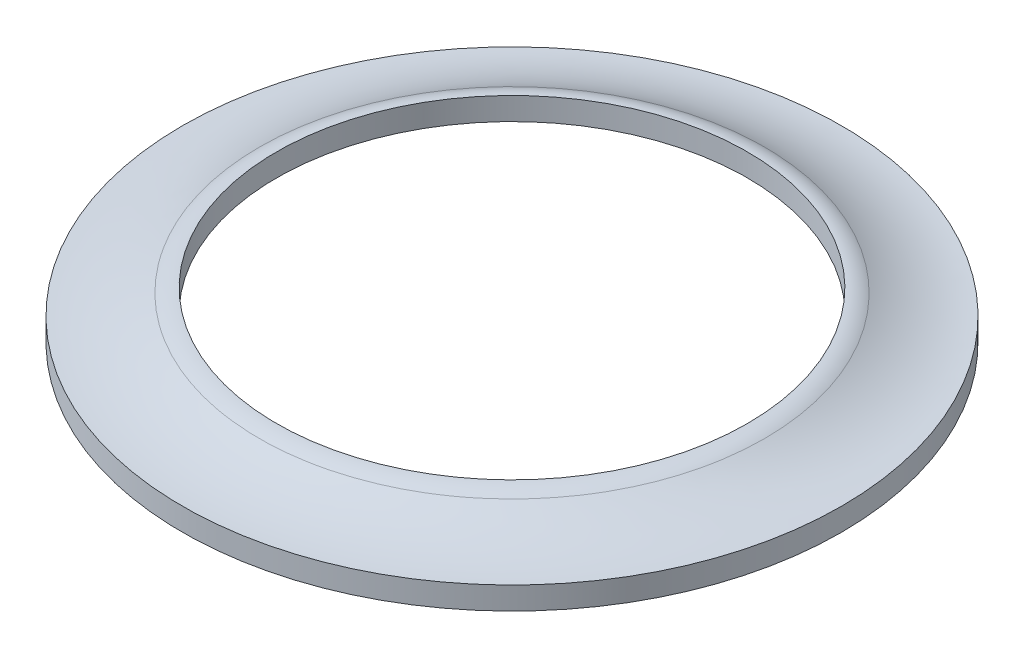
ISO-10303-21;
HEADER;
FILE_DESCRIPTION(('STEP AP214'),'2;1');
FILE_NAME('part.step','',(''),(''),'','','');
FILE_SCHEMA(('AUTOMOTIVE_DESIGN { 1 0 10303 214 1 1 1 1 }'));
ENDSEC;
DATA;
#1=APPLICATION_CONTEXT('core data for automotive mechanical design processes');
#2=APPLICATION_PROTOCOL_DEFINITION('international standard','automotive_design',2000,#1);
#3=PRODUCT_CONTEXT('',#1,'mechanical');
#4=PRODUCT('Part','Part','',(#3));
#5=PRODUCT_RELATED_PRODUCT_CATEGORY('part','',(#4));
#6=PRODUCT_DEFINITION_FORMATION('','',#4);
#7=PRODUCT_DEFINITION_CONTEXT('part definition',#1,'design');
#8=PRODUCT_DEFINITION('design','',#6,#7);
#9=PRODUCT_DEFINITION_SHAPE('','',#8);
#10=(LENGTH_UNIT() NAMED_UNIT(*) SI_UNIT(.MILLI.,.METRE.));
#11=(NAMED_UNIT(*) PLANE_ANGLE_UNIT() SI_UNIT($,.RADIAN.));
#12=(NAMED_UNIT(*) SI_UNIT($,.STERADIAN.) SOLID_ANGLE_UNIT());
#13=UNCERTAINTY_MEASURE_WITH_UNIT(LENGTH_MEASURE(1.E-05),#10,'distance_accuracy_value','');
#14=(GEOMETRIC_REPRESENTATION_CONTEXT(3) GLOBAL_UNCERTAINTY_ASSIGNED_CONTEXT((#13)) GLOBAL_UNIT_ASSIGNED_CONTEXT((#10,
#11,#12)) REPRESENTATION_CONTEXT('',''));
#15=CARTESIAN_POINT('',(0.,0.,0.));
#16=DIRECTION('',(0.,0.,1.));
#17=DIRECTION('',(1.,0.,0.));
#18=AXIS2_PLACEMENT_3D('',#15,#16,#17);
#19=CARTESIAN_POINT('',(0.,0.200464615384616,0.));
#20=DIRECTION('',(0.,-1.,0.));
#21=DIRECTION('',(1.,0.,0.));
#22=AXIS2_PLACEMENT_3D('',#19,#20,#21);
#23=TOROIDAL_SURFACE('',#22,3.96875,0.593285384615384);
#24=CARTESIAN_POINT('',(4.25772377294884,0.71861681903325,0.));
#25=CARTESIAN_POINT('',(4.25772377294884,0.71861681903325,0.55733473557947));
#26=CARTESIAN_POINT('',(4.1469066185021,0.718616819033126,1.11445019253542));
#27=CARTESIAN_POINT('',(3.72034107932625,0.718616819033375,2.14427050245358));
#28=CARTESIAN_POINT('',(3.40476052319012,0.718616819033165,2.6165701813527));
#29=CARTESIAN_POINT('',(2.6165701813525,0.718616819033336,3.40476052318989));
#30=CARTESIAN_POINT('',(2.14427050245361,0.718616819033335,3.72034107932631));
#31=CARTESIAN_POINT('',(1.1144501925354,0.718616819033163,4.14690661850203));
#32=CARTESIAN_POINT('',(0.557334735579084,0.71861681903325,4.25772377294884));
#33=CARTESIAN_POINT('',(-0.557334735579099,0.718616819033249,4.25772377294884));
#34=CARTESIAN_POINT('',(-1.11445019253532,0.718616819033175,4.14690661850204));
#35=CARTESIAN_POINT('',(-2.14427050245368,0.718616819033323,3.72034107932631));
#36=CARTESIAN_POINT('',(-2.61657018135237,0.718616819033295,3.4047605231901));
#37=CARTESIAN_POINT('',(-3.40476052319021,0.718616819033201,2.61657018135251));
#38=CARTESIAN_POINT('',(-3.72034107932638,0.718616819033309,2.14427050245356));
#39=CARTESIAN_POINT('',(-4.14690661850196,0.718616819033187,1.11445019253545));
#40=CARTESIAN_POINT('',(-4.25772377294884,0.718616819033248,0.557334735579082));
#41=CARTESIAN_POINT('',(-4.25772377294884,0.718616819033247,-0.5573347355791));
#42=CARTESIAN_POINT('',(-4.14690661850217,0.718616819033125,-1.11445019253524));
#43=CARTESIAN_POINT('',(-3.72034107932618,0.718616819033371,-2.14427050245376));
#44=CARTESIAN_POINT('',(-3.4047605231902,0.718616819033154,-2.61657018135264));
#45=CARTESIAN_POINT('',(-2.6165701813524,0.718616819033343,-3.40476052318996));
#46=CARTESIAN_POINT('',(-2.14427050245354,0.718616819033185,-3.72034107932663));
#47=CARTESIAN_POINT('',(-1.11445019253548,0.718616819033311,-4.14690661850171));
#48=CARTESIAN_POINT('',(-0.557334735579088,0.718616819033249,-4.25772377294884));
#49=CARTESIAN_POINT('',(0.557334735579093,0.718616819033249,-4.25772377294884));
#50=CARTESIAN_POINT('',(1.1144501925352,0.718616819033164,-4.14690661850211));
#51=CARTESIAN_POINT('',(2.14427050245381,0.718616819033335,-3.72034107932623));
#52=CARTESIAN_POINT('',(2.61657018135237,0.718616819033429,-3.40476052318977));
#53=CARTESIAN_POINT('',(3.40476052319023,0.71861681903307,-2.61657018135282));
#54=CARTESIAN_POINT('',(3.72034107932599,0.71861681903346,-2.14427050245379));
#55=CARTESIAN_POINT('',(4.14690661850235,0.718616819033039,-1.11445019253521));
#56=CARTESIAN_POINT('',(4.25772377294884,0.71861681903325,-0.55733473557947));
#57=CARTESIAN_POINT('',(4.25772377294884,0.71861681903325,0.));
#58=(BOUNDED_CURVE() B_SPLINE_CURVE(3,(#24,#25,#26,#27,#28,#29,#30,#31,#32,#33,#34,#35,#36,#37,
#38,#39,#40,#41,#42,#43,#44,#45,#46,#47,#48,#49,#50,#51,#52,#53,#54,#55,#56,#57),.UNSPECIFIED.,
.T.,.F.) B_SPLINE_CURVE_WITH_KNOTS((4,2,2,2,2,2,2,2,2,2,2,2,2,2,2,2,4),(-6.28318530717959,
-5.89048622548086,-5.49778714378214,-5.10508806208341,-4.71238898038469,-4.31968989868597,
-3.92699081698724,-3.53429173528852,-3.14159265358979,-2.74889357189107,-2.35619449019234,
-1.96349540849362,-1.5707963267949,-1.17809724509617,-0.785398163397448,-0.392699081698724,0.),
.UNSPECIFIED.) CURVE() GEOMETRIC_REPRESENTATION_ITEM() RATIONAL_B_SPLINE_CURVE((1.,1.,1.,1.,1.,
1.,1.,1.,1.,1.,1.,1.,1.,1.,1.,1.,1.,1.,1.,1.,1.,1.,1.,1.,1.,1.,1.,1.,1.,1.,1.,1.,1.,1.)) REPRESENTATION_ITEM(''));
#59=CARTESIAN_POINT('',(4.25772377294886,0.718616819033271,0.));
#60=VERTEX_POINT('',#59);
#61=CARTESIAN_POINT('',(-4.25772377294889,0.718616819033248,0.));
#62=VERTEX_POINT('',#61);
#63=EDGE_CURVE('E122',#60,#62,#58,.T.);
#64=ORIENTED_EDGE('',*,*,#63,.F.);
#65=CARTESIAN_POINT('',(0.,0.718616819033249,0.));
#66=DIRECTION('',(0.,1.,0.));
#67=DIRECTION('',(1.,0.,0.));
#68=AXIS2_PLACEMENT_3D('',#65,#66,#67);
#69=CIRCLE('',#68,4.25772377294884);
#70=EDGE_CURVE('E38',#60,#62,#69,.T.);
#71=ORIENTED_EDGE('',*,*,#70,.T.);
#72=EDGE_LOOP('',(#64,#71));
#73=FACE_BOUND('',#72,.T.);
#74=CARTESIAN_POINT('',(0.,0.793750000000001,0.));
#75=DIRECTION('',(0.,-1.,0.));
#76=DIRECTION('',(1.,0.,0.));
#77=AXIS2_PLACEMENT_3D('',#74,#75,#76);
#78=CIRCLE('',#77,3.96875);
#79=CARTESIAN_POINT('',(3.96875,0.793750000000002,0.));
#80=VERTEX_POINT('',#79);
#81=EDGE_CURVE('E123',#80,#80,#78,.T.);
#82=ORIENTED_EDGE('',*,*,#81,.T.);
#83=EDGE_LOOP('',(#82));
#84=FACE_BOUND('',#83,.T.);
#85=ADVANCED_FACE('F16',(#73,#84),#23,.T.);
#86=CARTESIAN_POINT('',(0.,0.,0.));
#87=DIRECTION('',(0.,-1.,0.));
#88=DIRECTION('',(1.,0.,0.));
#89=AXIS2_PLACEMENT_3D('',#86,#87,#88);
#90=CYLINDRICAL_SURFACE('',#89,3.96875);
#91=CARTESIAN_POINT('',(0.,0.412750000000001,0.));
#92=DIRECTION('',(0.,-1.,0.));
#93=DIRECTION('',(1.,0.,0.));
#94=AXIS2_PLACEMENT_3D('',#91,#92,#93);
#95=CIRCLE('',#94,3.96875);
#96=CARTESIAN_POINT('',(3.96875,0.412750000000002,0.));
#97=VERTEX_POINT('',#96);
#98=EDGE_CURVE('E117',#97,#97,#95,.T.);
#99=ORIENTED_EDGE('',*,*,#98,.T.);
#100=EDGE_LOOP('',(#99));
#101=FACE_BOUND('',#100,.T.);
#102=ORIENTED_EDGE('',*,*,#81,.F.);
#103=EDGE_LOOP('',(#102));
#104=FACE_BOUND('',#103,.T.);
#105=ADVANCED_FACE('F150',(#101,#104),#90,.F.);
#106=CARTESIAN_POINT('',(5.5696669872879,0.381000000000002,0.));
#107=CARTESIAN_POINT('',(5.5696669872879,0.381000000000002,0.729067699823068));
#108=CARTESIAN_POINT('',(5.42470346225363,0.380999999999996,1.45784855414463));
#109=CARTESIAN_POINT('',(4.86669920266455,0.381000000000008,2.80499000550708));
#110=CARTESIAN_POINT('',(4.45387801015091,0.380999999999998,3.42282058117365));
#111=CARTESIAN_POINT('',(3.42282058117335,0.381000000000006,4.45387801015057));
#112=CARTESIAN_POINT('',(2.80499000550693,0.380999999999999,4.86669920266422));
#113=CARTESIAN_POINT('',(1.4578485541448,0.381000000000004,5.42470346225396));
#114=CARTESIAN_POINT('',(0.729067699822562,0.381000000000001,5.5696669872879));
#115=CARTESIAN_POINT('',(-0.729067699822582,0.381000000000001,5.5696669872879));
#116=CARTESIAN_POINT('',(-1.45784855414463,0.380999999999999,5.42470346225363));
#117=CARTESIAN_POINT('',(-2.80499000550708,0.381000000000002,4.86669920266456));
#118=CARTESIAN_POINT('',(-3.42282058117333,0.381000000000002,4.45387801015059));
#119=CARTESIAN_POINT('',(-4.45387801015089,0.380999999999998,3.42282058117367));
#120=CARTESIAN_POINT('',(-4.86669920266455,0.380999999999994,2.80499000550694));
#121=CARTESIAN_POINT('',(-5.42470346225362,0.381000000000006,1.4578485541448));
#122=CARTESIAN_POINT('',(-5.5696669872879,0.381,0.729067699822559));
#123=CARTESIAN_POINT('',(-5.5696669872879,0.381,-0.729067699822583));
#124=CARTESIAN_POINT('',(-5.42470346225394,0.38100000000001,-1.45784855414478));
#125=CARTESIAN_POINT('',(-4.86669920266425,0.380999999999989,-2.80499000550693));
#126=CARTESIAN_POINT('',(-4.4538780101509,0.380999999999998,-3.42282058117366));
#127=CARTESIAN_POINT('',(-3.42282058117334,0.381000000000002,-4.45387801015059));
#128=CARTESIAN_POINT('',(-2.8049900055071,0.380999999999988,-4.86669920266454));
#129=CARTESIAN_POINT('',(-1.45784855414464,0.381000000000013,-5.42470346225364));
#130=CARTESIAN_POINT('',(-0.729067699822567,0.381000000000001,-5.5696669872879));
#131=CARTESIAN_POINT('',(0.729067699822575,0.381000000000001,-5.5696669872879));
#132=CARTESIAN_POINT('',(1.45784855414464,0.381000000000004,-5.42470346225395));
#133=CARTESIAN_POINT('',(2.80499000550709,0.380999999999999,-4.86669920266423));
#134=CARTESIAN_POINT('',(3.42282058117398,0.380999999999993,-4.45387801015089));
#135=CARTESIAN_POINT('',(4.45387801015027,0.381000000000011,-3.42282058117335));
#136=CARTESIAN_POINT('',(4.86669920266448,0.381000000000004,-2.80499000550714));
#137=CARTESIAN_POINT('',(5.42470346225371,0.381000000000001,-1.45784855414458));
#138=CARTESIAN_POINT('',(5.5696669872879,0.381000000000002,-0.729067699823067));
#139=CARTESIAN_POINT('',(5.5696669872879,0.381000000000002,0.));
#140=CARTESIAN_POINT('',(5.56295849364395,0.381000000000002,0.));
#141=CARTESIAN_POINT('',(5.56295849364395,0.381000000000002,0.728189560063288));
#142=CARTESIAN_POINT('',(5.41816957274464,0.380999999999999,1.45609262012171));
#143=CARTESIAN_POINT('',(4.8608374122303,0.381000000000005,2.80161148078267));
#144=CARTESIAN_POINT('',(4.44851345022476,0.381,3.41869789840544));
#145=CARTESIAN_POINT('',(3.41869789840514,0.381000000000004,4.44851345022442));
#146=CARTESIAN_POINT('',(2.80161148078253,0.381,4.86083741222997));
#147=CARTESIAN_POINT('',(1.45609262012188,0.381000000000003,5.41816957274495));
#148=CARTESIAN_POINT('',(0.728189560062783,0.381000000000001,5.56295849364395));
#149=CARTESIAN_POINT('',(-0.728189560062802,0.381000000000001,5.56295849364395));
#150=CARTESIAN_POINT('',(-1.4560926201217,0.381,5.41816957274463));
#151=CARTESIAN_POINT('',(-2.80161148078267,0.381000000000001,4.8608374122303));
#152=CARTESIAN_POINT('',(-3.41869789840512,0.381000000000001,4.44851345022444));
#153=CARTESIAN_POINT('',(-4.44851345022474,0.380999999999999,3.41869789840545));
#154=CARTESIAN_POINT('',(-4.86083741223029,0.380999999999997,2.80161148078253));
#155=CARTESIAN_POINT('',(-5.41816957274463,0.381000000000003,1.45609262012188));
#156=CARTESIAN_POINT('',(-5.56295849364395,0.381,0.72818956006278));
#157=CARTESIAN_POINT('',(-5.56295849364395,0.381,-0.728189560062803));
#158=CARTESIAN_POINT('',(-5.41816957274494,0.381000000000005,-1.45609262012186));
#159=CARTESIAN_POINT('',(-4.86083741222999,0.380999999999995,-2.80161148078252));
#160=CARTESIAN_POINT('',(-4.44851345022474,0.380999999999999,-3.41869789840545));
#161=CARTESIAN_POINT('',(-3.41869789840513,0.381000000000001,-4.44851345022443));
#162=CARTESIAN_POINT('',(-2.80161148078269,0.380999999999994,-4.86083741223029));
#163=CARTESIAN_POINT('',(-1.45609262012172,0.381000000000007,-5.41816957274463));
#164=CARTESIAN_POINT('',(-0.728189560062788,0.381000000000001,-5.56295849364395));
#165=CARTESIAN_POINT('',(0.728189560062795,0.381000000000001,-5.56295849364395));
#166=CARTESIAN_POINT('',(1.45609262012171,0.381000000000003,-5.41816957274495));
#167=CARTESIAN_POINT('',(2.80161148078268,0.381,-4.86083741222998));
#168=CARTESIAN_POINT('',(3.41869789840576,0.380999999999997,-4.44851345022474));
#169=CARTESIAN_POINT('',(4.44851345022412,0.381000000000007,-3.41869789840513));
#170=CARTESIAN_POINT('',(4.86083741223022,0.381000000000003,-2.80161148078273));
#171=CARTESIAN_POINT('',(5.41816957274471,0.381000000000002,-1.45609262012166));
#172=CARTESIAN_POINT('',(5.56295849364395,0.381000000000002,-0.728189560063287));
#173=CARTESIAN_POINT('',(5.56295849364395,0.381000000000002,0.));
#174=CARTESIAN_POINT('',(5.55625,0.381000000000002,0.));
#175=CARTESIAN_POINT('',(5.55625,0.381000000000002,0.727311420303508));
#176=CARTESIAN_POINT('',(5.41163568323564,0.381000000000002,1.45433668609878));
#177=CARTESIAN_POINT('',(4.85497562179604,0.381000000000002,2.79823295605826));
#178=CARTESIAN_POINT('',(4.4431488902986,0.381000000000002,3.41457521563722));
#179=CARTESIAN_POINT('',(3.41457521563693,0.381000000000002,4.44314889029827));
#180=CARTESIAN_POINT('',(2.79823295605812,0.381000000000002,4.85497562179572));
#181=CARTESIAN_POINT('',(1.45433668609895,0.381000000000001,5.41163568323595));
#182=CARTESIAN_POINT('',(0.727311420303003,0.381000000000001,5.55625));
#183=CARTESIAN_POINT('',(-0.727311420303023,0.381000000000001,5.55625));
#184=CARTESIAN_POINT('',(-1.45433668609878,0.381000000000001,5.41163568323564));
#185=CARTESIAN_POINT('',(-2.79823295605826,0.381,4.85497562179604));
#186=CARTESIAN_POINT('',(-3.41457521563691,0.381,4.44314889029829));
#187=CARTESIAN_POINT('',(-4.44314889029858,0.381,3.41457521563724));
#188=CARTESIAN_POINT('',(-4.85497562179604,0.381,2.79823295605812));
#189=CARTESIAN_POINT('',(-5.41163568323563,0.381,1.45433668609895));
#190=CARTESIAN_POINT('',(-5.55625,0.381,0.727311420303));
#191=CARTESIAN_POINT('',(-5.55625,0.381,-0.727311420303024));
#192=CARTESIAN_POINT('',(-5.41163568323595,0.381,-1.45433668609894));
#193=CARTESIAN_POINT('',(-4.85497562179573,0.381,-2.79823295605811));
#194=CARTESIAN_POINT('',(-4.44314889029859,0.381,-3.41457521563723));
#195=CARTESIAN_POINT('',(-3.41457521563691,0.381,-4.44314889029828));
#196=CARTESIAN_POINT('',(-2.79823295605828,0.381,-4.85497562179604));
#197=CARTESIAN_POINT('',(-1.4543366860988,0.381000000000001,-5.41163568323563));
#198=CARTESIAN_POINT('',(-0.727311420303008,0.381000000000001,-5.55625));
#199=CARTESIAN_POINT('',(0.727311420303016,0.381000000000001,-5.55625));
#200=CARTESIAN_POINT('',(1.45433668609879,0.381000000000001,-5.41163568323595));
#201=CARTESIAN_POINT('',(2.79823295605827,0.381000000000002,-4.85497562179572));
#202=CARTESIAN_POINT('',(3.41457521563755,0.381000000000002,-4.44314889029859));
#203=CARTESIAN_POINT('',(4.44314889029797,0.381000000000002,-3.41457521563691));
#204=CARTESIAN_POINT('',(4.85497562179595,0.381000000000002,-2.79823295605832));
#205=CARTESIAN_POINT('',(5.41163568323572,0.381000000000002,-1.45433668609874));
#206=CARTESIAN_POINT('',(5.55625,0.381000000000002,-0.727311420303507));
#207=CARTESIAN_POINT('',(5.55625,0.381000000000002,0.));
#208=CARTESIAN_POINT('',(4.86309669999952,0.381000000000003,0.));
#209=CARTESIAN_POINT('',(4.86309669999952,0.381000000000003,0.636577865997741));
#210=CARTESIAN_POINT('',(4.73652330847981,0.381000000000318,1.2729052758342));
#211=CARTESIAN_POINT('',(4.24930770302567,0.380999999999687,2.4491477983241));
#212=CARTESIAN_POINT('',(3.88885717993549,0.381000000000238,2.98860012833552));
#213=CARTESIAN_POINT('',(2.9886001283357,0.380999999999765,3.88885717993563));
#214=CARTESIAN_POINT('',(2.44914779832411,0.38100000000016,4.24930770302598));
#215=CARTESIAN_POINT('',(1.27290527583421,0.380999999999844,4.73652330847949));
#216=CARTESIAN_POINT('',(0.6365778659973,0.381000000000001,4.86309669999952));
#217=CARTESIAN_POINT('',(-0.636577865997317,0.381000000000001,4.86309669999952));
#218=CARTESIAN_POINT('',(-1.27290527583436,0.38100000000008,4.73652330848013));
#219=CARTESIAN_POINT('',(-2.44914779832394,0.380999999999922,4.24930770302536));
#220=CARTESIAN_POINT('',(-2.98860012833552,0.380999999999921,3.88885717993549));
#221=CARTESIAN_POINT('',(-3.88885717993563,0.381000000000079,2.98860012833569));
#222=CARTESIAN_POINT('',(-4.24930770302535,0.381000000000315,2.4491477983238));
#223=CARTESIAN_POINT('',(-4.73652330848012,0.380999999999684,1.27290527583453));
#224=CARTESIAN_POINT('',(-4.86309669999952,0.381000000000001,0.636577865997298));
#225=CARTESIAN_POINT('',(-4.86309669999952,0.381000000000001,-0.636577865997318));
#226=CARTESIAN_POINT('',(-4.73652330848076,0.380999999999447,-1.27290527583452));
#227=CARTESIAN_POINT('',(-4.24930770302473,0.381000000000551,-2.44914779832379));
#228=CARTESIAN_POINT('',(-3.88885717993563,0.381000000000078,-2.98860012833585));
#229=CARTESIAN_POINT('',(-2.98860012833553,0.38099999999992,-3.88885717993532));
#230=CARTESIAN_POINT('',(-2.44914779832403,0.381000000000631,-4.24930770302598));
#231=CARTESIAN_POINT('',(-1.27290527583429,0.380999999999369,-4.73652330847949));
#232=CARTESIAN_POINT('',(-0.636577865997304,0.381000000000001,-4.86309669999952));
#233=CARTESIAN_POINT('',(0.636577865997311,0.381000000000001,-4.86309669999952));
#234=CARTESIAN_POINT('',(1.27290527583413,0.380999999999844,-4.73652330847981));
#235=CARTESIAN_POINT('',(2.44914779832419,0.381000000000159,-4.24930770302567));
#236=CARTESIAN_POINT('',(2.98860012833616,0.381000000000476,-3.88885717993595));
#237=CARTESIAN_POINT('',(3.88885717993501,0.380999999999529,-2.98860012833521));
#238=CARTESIAN_POINT('',(4.24930770302496,0.380999999999924,-2.44914779832389));
#239=CARTESIAN_POINT('',(4.73652330848051,0.381000000000082,-1.27290527583442));
#240=CARTESIAN_POINT('',(4.86309669999952,0.381000000000003,-0.636577865997741));
#241=CARTESIAN_POINT('',(4.86309669999952,0.381000000000003,0.));
#242=CARTESIAN_POINT('',(4.25772377294884,0.71861681903325,0.));
#243=CARTESIAN_POINT('',(4.25772377294884,0.71861681903325,0.55733473557947));
#244=CARTESIAN_POINT('',(4.1469066185021,0.718616819033126,1.11445019253542));
#245=CARTESIAN_POINT('',(3.72034107932625,0.718616819033375,2.14427050245358));
#246=CARTESIAN_POINT('',(3.40476052319012,0.718616819033165,2.6165701813527));
#247=CARTESIAN_POINT('',(2.6165701813525,0.718616819033336,3.40476052318989));
#248=CARTESIAN_POINT('',(2.14427050245361,0.718616819033335,3.72034107932631));
#249=CARTESIAN_POINT('',(1.1144501925354,0.718616819033163,4.14690661850203));
#250=CARTESIAN_POINT('',(0.557334735579084,0.71861681903325,4.25772377294884));
#251=CARTESIAN_POINT('',(-0.557334735579099,0.718616819033249,4.25772377294884));
#252=CARTESIAN_POINT('',(-1.11445019253532,0.718616819033175,4.14690661850204));
#253=CARTESIAN_POINT('',(-2.14427050245368,0.718616819033323,3.72034107932631));
#254=CARTESIAN_POINT('',(-2.61657018135237,0.718616819033295,3.4047605231901));
#255=CARTESIAN_POINT('',(-3.40476052319021,0.718616819033201,2.61657018135251));
#256=CARTESIAN_POINT('',(-3.72034107932638,0.718616819033309,2.14427050245356));
#257=CARTESIAN_POINT('',(-4.14690661850196,0.718616819033187,1.11445019253545));
#258=CARTESIAN_POINT('',(-4.25772377294884,0.718616819033248,0.557334735579082));
#259=CARTESIAN_POINT('',(-4.25772377294884,0.718616819033247,-0.5573347355791));
#260=CARTESIAN_POINT('',(-4.14690661850217,0.718616819033125,-1.11445019253524));
#261=CARTESIAN_POINT('',(-3.72034107932618,0.718616819033371,-2.14427050245376));
#262=CARTESIAN_POINT('',(-3.4047605231902,0.718616819033154,-2.61657018135264));
#263=CARTESIAN_POINT('',(-2.6165701813524,0.718616819033343,-3.40476052318996));
#264=CARTESIAN_POINT('',(-2.14427050245354,0.718616819033185,-3.72034107932663));
#265=CARTESIAN_POINT('',(-1.11445019253548,0.718616819033311,-4.14690661850171));
#266=CARTESIAN_POINT('',(-0.557334735579088,0.718616819033249,-4.25772377294884));
#267=CARTESIAN_POINT('',(0.557334735579093,0.718616819033249,-4.25772377294884));
#268=CARTESIAN_POINT('',(1.1144501925352,0.718616819033164,-4.14690661850211));
#269=CARTESIAN_POINT('',(2.14427050245381,0.718616819033335,-3.72034107932623));
#270=CARTESIAN_POINT('',(2.61657018135237,0.718616819033429,-3.40476052318977));
#271=CARTESIAN_POINT('',(3.40476052319023,0.71861681903307,-2.61657018135282));
#272=CARTESIAN_POINT('',(3.72034107932599,0.71861681903346,-2.14427050245379));
#273=CARTESIAN_POINT('',(4.14690661850235,0.718616819033039,-1.11445019253521));
#274=CARTESIAN_POINT('',(4.25772377294884,0.71861681903325,-0.55733473557947));
#275=CARTESIAN_POINT('',(4.25772377294884,0.71861681903325,0.));
#276=(BOUNDED_SURFACE() B_SPLINE_SURFACE(2,3,((#106,#107,#108,#109,#110,#111,#112,#113,#114,
#115,#116,#117,#118,#119,#120,#121,#122,#123,#124,#125,#126,#127,#128,#129,#130,#131,#132,#133,
#134,#135,#136,#137,#138,#139),(#140,#141,#142,#143,#144,#145,#146,#147,#148,#149,#150,#151,
#152,#153,#154,#155,#156,#157,#158,#159,#160,#161,#162,#163,#164,#165,#166,#167,#168,#169,#170,
#171,#172,#173),(#174,#175,#176,#177,#178,#179,#180,#181,#182,#183,#184,#185,#186,#187,#188,
#189,#190,#191,#192,#193,#194,#195,#196,#197,#198,#199,#200,#201,#202,#203,#204,#205,#206,#207),
(#208,#209,#210,#211,#212,#213,#214,#215,#216,#217,#218,#219,#220,#221,#222,#223,#224,#225,#226,
#227,#228,#229,#230,#231,#232,#233,#234,#235,#236,#237,#238,#239,#240,#241),(#242,#243,#244,
#245,#246,#247,#248,#249,#250,#251,#252,#253,#254,#255,#256,#257,#258,#259,#260,#261,#262,#263,
#264,#265,#266,#267,#268,#269,#270,#271,#272,#273,#274,#275)),.UNSPECIFIED.,.F.,.T.,
.F.) B_SPLINE_SURFACE_WITH_KNOTS((3,2,3),(4,2,2,2,2,2,2,2,2,2,2,2,2,2,2,2,4),(-0.01,0.,1.),
(-6.28318530717959,-5.89048622548086,-5.49778714378214,-5.10508806208341,-4.71238898038469,
-4.31968989868597,-3.92699081698724,-3.53429173528852,-3.14159265358979,-2.74889357189107,
-2.35619449019234,-1.96349540849362,-1.5707963267949,-1.17809724509617,-0.785398163397448,
-0.392699081698724,0.),
.UNSPECIFIED.) GEOMETRIC_REPRESENTATION_ITEM() RATIONAL_B_SPLINE_SURFACE(((1.,1.,1.,1.,1.,1.,1.,
1.,1.,1.,1.,1.,1.,1.,1.,1.,1.,1.,1.,1.,1.,1.,1.,1.,1.,1.,1.,1.,1.,1.,1.,1.,1.,1.),(1.,1.,1.,1.,
1.,1.,1.,1.,1.,1.,1.,1.,1.,1.,1.,1.,1.,1.,1.,1.,1.,1.,1.,1.,1.,1.,1.,1.,1.,1.,1.,1.,1.,1.),(1.,
1.,1.,1.,1.,1.,1.,1.,1.,1.,1.,1.,1.,1.,1.,1.,1.,1.,1.,1.,1.,1.,1.,1.,1.,1.,1.,1.,1.,1.,1.,1.,1.,
1.),(0.96782250678823,0.96782250678823,0.96782250678823,0.96782250678823,0.96782250678823,
0.96782250678823,0.96782250678823,0.96782250678823,0.96782250678823,0.96782250678823,
0.96782250678823,0.96782250678823,0.96782250678823,0.96782250678823,0.96782250678823,
0.96782250678823,0.96782250678823,0.96782250678823,0.96782250678823,0.96782250678823,
0.96782250678823,0.96782250678823,0.96782250678823,0.96782250678823,0.96782250678823,
0.96782250678823,0.96782250678823,0.96782250678823,0.96782250678823,0.96782250678823,
0.96782250678823,0.96782250678823,0.96782250678823,0.96782250678823),(1.,1.,1.,1.,1.,1.,1.,1.,
1.,1.,1.,1.,1.,1.,1.,1.,1.,1.,1.,1.,1.,1.,1.,1.,1.,1.,1.,1.,1.,1.,1.,1.,1.,1.))) REPRESENTATION_ITEM('') SURFACE());
#277=CARTESIAN_POINT('',(0.,0.381000000000001,0.));
#278=DIRECTION('',(0.,-1.,0.));
#279=DIRECTION('',(1.,0.,0.));
#280=AXIS2_PLACEMENT_3D('',#277,#278,#279);
#281=CIRCLE('',#280,5.55625);
#282=CARTESIAN_POINT('',(5.55625,0.381000000000002,0.));
#283=VERTEX_POINT('',#282);
#284=EDGE_CURVE('E62',#283,#283,#281,.T.);
#285=ORIENTED_EDGE('',*,*,#63,.T.);
#286=ORIENTED_EDGE('',*,*,#70,.F.);
#287=EDGE_LOOP('',(#285,#286));
#288=FACE_BOUND('',#287,.T.);
#289=ORIENTED_EDGE('',*,*,#284,.F.);
#290=EDGE_LOOP('',(#289));
#291=FACE_BOUND('',#290,.T.);
#292=ADVANCED_FACE('F83',(#288,#291),#276,.T.);
#293=CARTESIAN_POINT('',(0.,0.200464615384616,0.));
#294=DIRECTION('',(0.,-1.,0.));
#295=DIRECTION('',(1.,0.,0.));
#296=AXIS2_PLACEMENT_3D('',#293,#294,#295);
#297=TOROIDAL_SURFACE('',#296,3.96875,0.212285384615384);
#298=CARTESIAN_POINT('',(4.07214865118022,0.385866350693145,0.));
#299=CARTESIAN_POINT('',(4.07214865118022,0.385866350693145,-0.533043009075706));
#300=CARTESIAN_POINT('',(3.96616152048032,0.385866350693033,-1.06587629690137));
#301=CARTESIAN_POINT('',(3.55818806385737,0.385866350693257,-2.05081134896766));
#302=CARTESIAN_POINT('',(3.25636225163048,0.385866350693078,-2.50252559886806));
#303=CARTESIAN_POINT('',(2.50252559886789,0.385866350693213,-3.2563622516303));
#304=CARTESIAN_POINT('',(2.05081134896766,0.385866350693132,-3.55818806385762));
#305=CARTESIAN_POINT('',(1.06587629690137,0.385866350693157,-3.96616152048007));
#306=CARTESIAN_POINT('',(0.533043009075346,0.385866350693144,-4.07214865118022));
#307=CARTESIAN_POINT('',(-0.533043009075341,0.385866350693144,-4.07214865118022));
#308=CARTESIAN_POINT('',(-1.06587629690163,0.385866350693143,-3.96616152047999));
#309=CARTESIAN_POINT('',(-2.05081134896741,0.385866350693144,-3.55818806385769));
#310=CARTESIAN_POINT('',(-2.50252559886779,0.385866350693285,-3.25636225163021));
#311=CARTESIAN_POINT('',(-3.25636225163057,0.385866350693001,-2.50252559886816));
#312=CARTESIAN_POINT('',(-3.55818806385726,0.385866350693355,-2.05081134896748));
#313=CARTESIAN_POINT('',(-3.96616152048044,0.385866350692931,-1.06587629690154));
#314=CARTESIAN_POINT('',(-4.07214865118022,0.385866350693142,-0.533043009075352));
#315=CARTESIAN_POINT('',(-4.07214865118022,0.385866350693143,0.533043009075335));
#316=CARTESIAN_POINT('',(-3.96616152047992,0.385866350693154,1.06587629690176));
#317=CARTESIAN_POINT('',(-3.55818806385777,0.385866350693132,2.05081134896728));
#318=CARTESIAN_POINT('',(-3.25636225163044,0.385866350693229,2.50252559886772));
#319=CARTESIAN_POINT('',(-2.50252559886792,0.385866350693058,3.25636225163066));
#320=CARTESIAN_POINT('',(-2.05081134896756,0.38586635069302,3.55818806385787));
#321=CARTESIAN_POINT('',(-1.06587629690146,0.385866350693267,3.96616152047982));
#322=CARTESIAN_POINT('',(-0.533043009075352,0.385866350693144,4.07214865118022));
#323=CARTESIAN_POINT('',(0.533043009075337,0.385866350693145,4.07214865118022));
#324=CARTESIAN_POINT('',(1.06587629690158,0.385866350693219,3.96616152047987));
#325=CARTESIAN_POINT('',(2.05081134896746,0.385866350693071,3.55818806385782));
#326=CARTESIAN_POINT('',(2.50252559886788,0.385866350693231,3.25636225163028));
#327=CARTESIAN_POINT('',(3.25636225163051,0.38586635069306,2.50252559886808));
#328=CARTESIAN_POINT('',(3.55818806385763,0.385866350693158,2.0508113489675));
#329=CARTESIAN_POINT('',(3.96616152048006,0.385866350693131,1.06587629690152));
#330=CARTESIAN_POINT('',(4.07214865118022,0.385866350693145,0.533043009075707));
#331=CARTESIAN_POINT('',(4.07214865118022,0.385866350693145,0.));
#332=(BOUNDED_CURVE() B_SPLINE_CURVE(3,(#298,#299,#300,#301,#302,#303,#304,#305,#306,#307,#308,
#309,#310,#311,#312,#313,#314,#315,#316,#317,#318,#319,#320,#321,#322,#323,#324,#325,#326,#327,
#328,#329,#330,#331),.UNSPECIFIED.,.T.,.F.) B_SPLINE_CURVE_WITH_KNOTS((4,2,2,2,2,2,2,2,2,2,2,2,
2,2,2,2,4),(-6.28318530717959,-5.89048622548086,-5.49778714378214,-5.10508806208341,
-4.71238898038469,-4.31968989868597,-3.92699081698724,-3.53429173528852,-3.14159265358979,
-2.74889357189107,-2.35619449019234,-1.96349540849362,-1.5707963267949,-1.17809724509617,
-0.785398163397448,-0.392699081698725,0.),
.UNSPECIFIED.) CURVE() GEOMETRIC_REPRESENTATION_ITEM() RATIONAL_B_SPLINE_CURVE((1.,1.,1.,1.,1.,
1.,1.,1.,1.,1.,1.,1.,1.,1.,1.,1.,1.,1.,1.,1.,1.,1.,1.,1.,1.,1.,1.,1.,1.,1.,1.,1.,1.,1.)) REPRESENTATION_ITEM(''));
#333=CARTESIAN_POINT('',(4.07214865118022,0.385866350693145,0.));
#334=VERTEX_POINT('',#333);
#335=CARTESIAN_POINT('',(-4.07214865118022,0.385866350693143,0.));
#336=VERTEX_POINT('',#335);
#337=EDGE_CURVE('E52',#334,#336,#332,.T.);
#338=ORIENTED_EDGE('',*,*,#337,.F.);
#339=CARTESIAN_POINT('',(4.07214865118039,0.385866350693046,0.));
#340=CARTESIAN_POINT('',(4.07214865118039,0.385866350693046,-0.533043009075729));
#341=CARTESIAN_POINT('',(3.96616152048049,0.385866350692934,-1.06587629690142));
#342=CARTESIAN_POINT('',(3.55818806385753,0.385866350693159,-2.05081134896775));
#343=CARTESIAN_POINT('',(3.25636225163062,0.385866350692979,-2.50252559886817));
#344=CARTESIAN_POINT('',(2.502525598868,0.385866350693114,-3.25636225163045));
#345=CARTESIAN_POINT('',(2.05081134896775,0.385866350693033,-3.55818806385777));
#346=CARTESIAN_POINT('',(1.06587629690142,0.385866350693058,-3.96616152048025));
#347=CARTESIAN_POINT('',(0.53304300907537,0.385866350693045,-4.07214865118039));
#348=CARTESIAN_POINT('',(-0.533043009075364,0.385866350693046,-4.07214865118039));
#349=CARTESIAN_POINT('',(-1.06587629690168,0.385866350693044,-3.96616152048017));
#350=CARTESIAN_POINT('',(-2.0508113489675,0.385866350693046,-3.55818806385785));
#351=CARTESIAN_POINT('',(-2.5025255988679,0.385866350693186,-3.25636225163036));
#352=CARTESIAN_POINT('',(-3.25636225163071,0.385866350692902,-2.50252559886827));
#353=CARTESIAN_POINT('',(-3.55818806385741,0.385866350693257,-2.05081134896757));
#354=CARTESIAN_POINT('',(-3.96616152048061,0.385866350692832,-1.06587629690159));
#355=CARTESIAN_POINT('',(-4.07214865118039,0.385866350693044,-0.533043009075375));
#356=CARTESIAN_POINT('',(-4.07214865118039,0.385866350693045,0.533043009075358));
#357=CARTESIAN_POINT('',(-3.96616152048009,0.385866350693055,1.06587629690181));
#358=CARTESIAN_POINT('',(-3.55818806385792,0.385866350693034,2.05081134896737));
#359=CARTESIAN_POINT('',(-3.25636225163058,0.38586635069313,2.50252559886783));
#360=CARTESIAN_POINT('',(-2.50252559886803,0.385866350692959,3.25636225163081));
#361=CARTESIAN_POINT('',(-2.05081134896765,0.385866350692921,3.55818806385803));
#362=CARTESIAN_POINT('',(-1.0658762969015,0.385866350693169,3.96616152048));
#363=CARTESIAN_POINT('',(-0.533043009075375,0.385866350693045,4.07214865118039));
#364=CARTESIAN_POINT('',(0.533043009075361,0.385866350693046,4.07214865118039));
#365=CARTESIAN_POINT('',(1.06587629690163,0.38586635069312,3.96616152048004));
#366=CARTESIAN_POINT('',(2.05081134896755,0.385866350692972,3.55818806385797));
#367=CARTESIAN_POINT('',(2.50252559886799,0.385866350693132,3.25636225163042));
#368=CARTESIAN_POINT('',(3.25636225163065,0.385866350692961,2.50252559886818));
#369=CARTESIAN_POINT('',(3.55818806385779,0.385866350693059,2.05081134896759));
#370=CARTESIAN_POINT('',(3.96616152048024,0.385866350693033,1.06587629690156));
#371=CARTESIAN_POINT('',(4.07214865118039,0.385866350693046,0.53304300907573));
#372=CARTESIAN_POINT('',(4.07214865118039,0.385866350693046,0.));
#373=(BOUNDED_CURVE() B_SPLINE_CURVE(3,(#339,#340,#341,#342,#343,#344,#345,#346,#347,#348,#349,
#350,#351,#352,#353,#354,#355,#356,#357,#358,#359,#360,#361,#362,#363,#364,#365,#366,#367,#368,
#369,#370,#371,#372),.UNSPECIFIED.,.T.,.F.) B_SPLINE_CURVE_WITH_KNOTS((4,2,2,2,2,2,2,2,2,2,2,2,
2,2,2,2,4),(-6.28318530717959,-5.89048622548086,-5.49778714378214,-5.10508806208341,
-4.71238898038469,-4.31968989868597,-3.92699081698724,-3.53429173528852,-3.14159265358979,
-2.74889357189107,-2.35619449019234,-1.96349540849362,-1.5707963267949,-1.17809724509617,
-0.785398163397448,-0.392699081698725,0.),
.UNSPECIFIED.) CURVE() GEOMETRIC_REPRESENTATION_ITEM() RATIONAL_B_SPLINE_CURVE((0.999999999999992,
0.999999999999992,0.999999999999992,0.999999999999992,0.999999999999992,0.999999999999992,
0.999999999999992,0.999999999999992,0.999999999999992,0.999999999999992,0.999999999999992,
0.999999999999992,0.999999999999992,0.999999999999992,0.999999999999992,0.999999999999992,
0.999999999999992,0.999999999999992,0.999999999999992,0.999999999999992,0.999999999999992,
0.999999999999992,0.999999999999992,0.999999999999992,0.999999999999992,0.999999999999992,
0.999999999999992,0.999999999999992,0.999999999999992,0.999999999999992,0.999999999999992,
0.999999999999992,0.999999999999992,0.999999999999992)) REPRESENTATION_ITEM(''));
#374=EDGE_CURVE('E30',#336,#334,#373,.T.);
#375=ORIENTED_EDGE('',*,*,#374,.F.);
#376=EDGE_LOOP('',(#338,#375));
#377=FACE_BOUND('',#376,.T.);
#378=ORIENTED_EDGE('',*,*,#98,.F.);
#379=EDGE_LOOP('',(#378));
#380=FACE_BOUND('',#379,.T.);
#381=ADVANCED_FACE('F59',(#377,#380),#297,.F.);
#382=CARTESIAN_POINT('',(0.,0.,0.));
#383=DIRECTION('',(0.,-1.,0.));
#384=DIRECTION('',(1.,0.,0.));
#385=AXIS2_PLACEMENT_3D('',#382,#383,#384);
#386=CYLINDRICAL_SURFACE('',#385,5.55625);
#387=ORIENTED_EDGE('',*,*,#284,.T.);
#388=EDGE_LOOP('',(#387));
#389=FACE_BOUND('',#388,.T.);
#390=CARTESIAN_POINT('',(0.,0.,0.));
#391=DIRECTION('',(0.,-1.,0.));
#392=DIRECTION('',(1.,0.,0.));
#393=AXIS2_PLACEMENT_3D('',#390,#391,#392);
#394=CIRCLE('',#393,5.55625);
#395=CARTESIAN_POINT('',(5.55625,0.,0.));
#396=VERTEX_POINT('',#395);
#397=EDGE_CURVE('E11',#396,#396,#394,.T.);
#398=ORIENTED_EDGE('',*,*,#397,.F.);
#399=EDGE_LOOP('',(#398));
#400=FACE_BOUND('',#399,.T.);
#401=ADVANCED_FACE('F82',(#389,#400),#386,.T.);
#402=CARTESIAN_POINT('',(4.07214865118022,0.385866350693145,0.));
#403=CARTESIAN_POINT('',(4.07214865118022,0.385866350693145,0.533043009075707));
#404=CARTESIAN_POINT('',(3.96616152048006,0.385866350693131,1.06587629690152));
#405=CARTESIAN_POINT('',(3.55818806385763,0.385866350693158,2.0508113489675));
#406=CARTESIAN_POINT('',(3.25636225163051,0.38586635069306,2.50252559886808));
#407=CARTESIAN_POINT('',(2.50252559886788,0.385866350693231,3.25636225163028));
#408=CARTESIAN_POINT('',(2.05081134896746,0.385866350693071,3.55818806385782));
#409=CARTESIAN_POINT('',(1.06587629690158,0.385866350693219,3.96616152047987));
#410=CARTESIAN_POINT('',(0.533043009075337,0.385866350693145,4.07214865118022));
#411=CARTESIAN_POINT('',(-0.533043009075352,0.385866350693144,4.07214865118022));
#412=CARTESIAN_POINT('',(-1.06587629690146,0.385866350693267,3.96616152047982));
#413=CARTESIAN_POINT('',(-2.05081134896756,0.38586635069302,3.55818806385787));
#414=CARTESIAN_POINT('',(-2.50252559886792,0.385866350693058,3.25636225163066));
#415=CARTESIAN_POINT('',(-3.25636225163044,0.385866350693229,2.50252559886772));
#416=CARTESIAN_POINT('',(-3.55818806385777,0.385866350693132,2.05081134896728));
#417=CARTESIAN_POINT('',(-3.96616152047992,0.385866350693154,1.06587629690176));
#418=CARTESIAN_POINT('',(-4.07214865118022,0.385866350693143,0.533043009075335));
#419=CARTESIAN_POINT('',(-4.07214865118022,0.385866350693142,-0.533043009075352));
#420=CARTESIAN_POINT('',(-3.96616152048044,0.385866350692931,-1.06587629690154));
#421=CARTESIAN_POINT('',(-3.55818806385726,0.385866350693355,-2.05081134896748));
#422=CARTESIAN_POINT('',(-3.25636225163057,0.385866350693001,-2.50252559886816));
#423=CARTESIAN_POINT('',(-2.50252559886779,0.385866350693285,-3.25636225163021));
#424=CARTESIAN_POINT('',(-2.05081134896741,0.385866350693144,-3.55818806385769));
#425=CARTESIAN_POINT('',(-1.06587629690163,0.385866350693143,-3.96616152047999));
#426=CARTESIAN_POINT('',(-0.533043009075341,0.385866350693144,-4.07214865118022));
#427=CARTESIAN_POINT('',(0.533043009075346,0.385866350693144,-4.07214865118022));
#428=CARTESIAN_POINT('',(1.06587629690137,0.385866350693157,-3.96616152048007));
#429=CARTESIAN_POINT('',(2.05081134896766,0.385866350693132,-3.55818806385762));
#430=CARTESIAN_POINT('',(2.50252559886789,0.385866350693213,-3.2563622516303));
#431=CARTESIAN_POINT('',(3.25636225163048,0.385866350693078,-2.50252559886806));
#432=CARTESIAN_POINT('',(3.55818806385737,0.385866350693257,-2.05081134896766));
#433=CARTESIAN_POINT('',(3.96616152048032,0.385866350693033,-1.06587629690137));
#434=CARTESIAN_POINT('',(4.07214865118022,0.385866350693145,-0.533043009075706));
#435=CARTESIAN_POINT('',(4.07214865118022,0.385866350693145,0.));
#436=CARTESIAN_POINT('',(4.7640367,0.,0.));
#437=CARTESIAN_POINT('',(4.7640367,0.,0.623610942390107));
#438=CARTESIAN_POINT('',(4.64004157515694,0.,1.24697653034532));
#439=CARTESIAN_POINT('',(4.16275042336829,0.,2.39925930219317));
#440=CARTESIAN_POINT('',(3.80964218257708,-7.86167381443562E-13,2.92772313020514));
#441=CARTESIAN_POINT('',(2.9277231302061,7.90937871002499E-13,3.80964218257801));
#442=CARTESIAN_POINT('',(2.39925930219311,0.,4.1627504233686));
#443=CARTESIAN_POINT('',(1.24697653034542,0.,4.64004157515662));
#444=CARTESIAN_POINT('',(0.623610942389675,0.,4.7640367));
#445=CARTESIAN_POINT('',(-0.623610942389692,0.,4.7640367));
#446=CARTESIAN_POINT('',(-1.24697653034501,0.,4.640041575156));
#447=CARTESIAN_POINT('',(-2.39925930219349,0.,4.16275042336924));
#448=CARTESIAN_POINT('',(-2.92772313020546,2.34614223956435E-13,3.80964218257739));
#449=CARTESIAN_POINT('',(-3.80964218257769,-2.38517351777383E-13,2.92772313020579));
#450=CARTESIAN_POINT('',(-4.16275042336892,2.34180543087441E-13,2.39925930219319));
#451=CARTESIAN_POINT('',(-4.6400415751563,-2.38951032646377E-13,1.24697653034534));
#452=CARTESIAN_POINT('',(-4.7640367,0.,0.623610942389673));
#453=CARTESIAN_POINT('',(-4.7640367,0.,-0.623610942389693));
#454=CARTESIAN_POINT('',(-4.64004157515694,1.56626323072121E-13,-1.2469765303454));
#455=CARTESIAN_POINT('',(-4.16275042336829,-1.58794727417092E-13,-2.39925930219309));
#456=CARTESIAN_POINT('',(-3.8096421825777,-4.7226421399583E-13,-2.92772313020594));
#457=CARTESIAN_POINT('',(-2.92772313020546,4.73998937471807E-13,-3.80964218257723));
#458=CARTESIAN_POINT('',(-2.39925930219327,-4.73348416168316E-13,-4.1627504233686));
#459=CARTESIAN_POINT('',(-1.24697653034526,4.72914735299322E-13,-4.64004157515662));
#460=CARTESIAN_POINT('',(-0.62361094238968,0.,-4.7640367));
#461=CARTESIAN_POINT('',(0.623610942389686,0.,-4.7640367));
#462=CARTESIAN_POINT('',(1.24697653034525,3.18673657006669E-13,-4.64004157515694));
#463=CARTESIAN_POINT('',(2.39925930219326,-3.12168443971756E-13,-4.16275042336829));
#464=CARTESIAN_POINT('',(2.92772313020562,4.73998937471807E-13,-3.80964218257723));
#465=CARTESIAN_POINT('',(3.80964218257755,-4.7226421399583E-13,-2.92772313020593));
#466=CARTESIAN_POINT('',(4.16275042336916,-2.34397383522011E-13,-2.39925930219359));
#467=CARTESIAN_POINT('',(4.64004157515607,2.38734192211953E-13,-1.24697653034492));
#468=CARTESIAN_POINT('',(4.7640367,0.,-0.623610942390107));
#469=CARTESIAN_POINT('',(4.7640367,0.,0.));
#470=CARTESIAN_POINT('',(5.55625,0.,0.));
#471=CARTESIAN_POINT('',(5.55625,0.,0.727311420303508));
#472=CARTESIAN_POINT('',(5.41163568323564,0.,1.45433668609878));
#473=CARTESIAN_POINT('',(4.85497562179604,0.,2.79823295605826));
#474=CARTESIAN_POINT('',(4.4431488902986,0.,3.41457521563722));
#475=CARTESIAN_POINT('',(3.41457521563693,0.,4.44314889029827));
#476=CARTESIAN_POINT('',(2.79823295605812,0.,4.85497562179572));
#477=CARTESIAN_POINT('',(1.45433668609895,0.,5.41163568323595));
#478=CARTESIAN_POINT('',(0.727311420303003,0.,5.55625));
#479=CARTESIAN_POINT('',(-0.727311420303022,0.,5.55625));
#480=CARTESIAN_POINT('',(-1.45433668609878,0.,5.41163568323564));
#481=CARTESIAN_POINT('',(-2.79823295605826,0.,4.85497562179604));
#482=CARTESIAN_POINT('',(-3.41457521563691,0.,4.44314889029829));
#483=CARTESIAN_POINT('',(-4.44314889029858,0.,3.41457521563724));
#484=CARTESIAN_POINT('',(-4.85497562179604,0.,2.79823295605812));
#485=CARTESIAN_POINT('',(-5.41163568323563,0.,1.45433668609895));
#486=CARTESIAN_POINT('',(-5.55625,0.,0.727311420303));
#487=CARTESIAN_POINT('',(-5.55625,0.,-0.727311420303024));
#488=CARTESIAN_POINT('',(-5.41163568323595,0.,-1.45433668609894));
#489=CARTESIAN_POINT('',(-4.85497562179573,0.,-2.79823295605811));
#490=CARTESIAN_POINT('',(-4.44314889029859,0.,-3.41457521563723));
#491=CARTESIAN_POINT('',(-3.41457521563691,0.,-4.44314889029828));
#492=CARTESIAN_POINT('',(-2.79823295605828,0.,-4.85497562179604));
#493=CARTESIAN_POINT('',(-1.4543366860988,0.,-5.41163568323563));
#494=CARTESIAN_POINT('',(-0.727311420303008,0.,-5.55625));
#495=CARTESIAN_POINT('',(0.727311420303016,0.,-5.55625));
#496=CARTESIAN_POINT('',(1.45433668609879,0.,-5.41163568323595));
#497=CARTESIAN_POINT('',(2.79823295605827,0.,-4.85497562179572));
#498=CARTESIAN_POINT('',(3.41457521563755,0.,-4.44314889029859));
#499=CARTESIAN_POINT('',(4.44314889029797,0.,-3.41457521563691));
#500=CARTESIAN_POINT('',(4.85497562179595,0.,-2.79823295605832));
#501=CARTESIAN_POINT('',(5.41163568323572,0.,-1.45433668609874));
#502=CARTESIAN_POINT('',(5.55625,0.,-0.727311420303507));
#503=CARTESIAN_POINT('',(5.55625,0.,0.));
#504=CARTESIAN_POINT('',(5.56391721861917,0.,0.));
#505=CARTESIAN_POINT('',(5.56391721861917,0.,0.728315056868401));
#506=CARTESIAN_POINT('',(5.41910334467467,0.,1.45634356435627));
#507=CARTESIAN_POINT('',(4.86167513306409,0.,2.80209431287653));
#508=CARTESIAN_POINT('',(4.44928011079794,0.,3.4192870796948));
#509=CARTESIAN_POINT('',(3.41928707969449,0.,4.4492801107976));
#510=CARTESIAN_POINT('',(2.80209431287638,0.,4.86167513306376));
#511=CARTESIAN_POINT('',(1.45634356435645,0.,5.41910334467499));
#512=CARTESIAN_POINT('',(0.728315056867896,0.,5.56391721861917));
#513=CARTESIAN_POINT('',(-0.728315056867915,0.,5.56391721861917));
#514=CARTESIAN_POINT('',(-1.45634356435628,0.,5.41910334467468));
#515=CARTESIAN_POINT('',(-2.80209431287652,0.,4.86167513306408));
#516=CARTESIAN_POINT('',(-3.41928707969448,0.,4.44928011079762));
#517=CARTESIAN_POINT('',(-4.44928011079792,0.,3.41928707969481));
#518=CARTESIAN_POINT('',(-4.86167513306407,0.,2.80209431287638));
#519=CARTESIAN_POINT('',(-5.41910334467467,0.,1.45634356435645));
#520=CARTESIAN_POINT('',(-5.56391721861917,0.,0.728315056867893));
#521=CARTESIAN_POINT('',(-5.56391721861917,0.,-0.728315056867916));
#522=CARTESIAN_POINT('',(-5.41910334467499,0.,-1.45634356435643));
#523=CARTESIAN_POINT('',(-4.86167513306377,0.,-2.80209431287637));
#524=CARTESIAN_POINT('',(-4.44928011079793,0.,-3.41928707969481));
#525=CARTESIAN_POINT('',(-3.41928707969449,0.,-4.44928011079762));
#526=CARTESIAN_POINT('',(-2.80209431287654,0.,-4.86167513306408));
#527=CARTESIAN_POINT('',(-1.45634356435629,0.,-5.41910334467467));
#528=CARTESIAN_POINT('',(-0.7283150568679,0.,-5.56391721861917));
#529=CARTESIAN_POINT('',(0.728315056867908,0.,-5.56391721861917));
#530=CARTESIAN_POINT('',(1.45634356435628,0.,-5.41910334467499));
#531=CARTESIAN_POINT('',(2.80209431287653,0.,-4.86167513306376));
#532=CARTESIAN_POINT('',(3.41928707969513,0.,-4.44928011079793));
#533=CARTESIAN_POINT('',(4.4492801107973,0.,-3.41928707969448));
#534=CARTESIAN_POINT('',(4.86167513306399,0.,-2.80209431287658));
#535=CARTESIAN_POINT('',(5.41910334467477,0.,-1.45634356435623));
#536=CARTESIAN_POINT('',(5.56391721861917,0.,-0.7283150568684));
#537=CARTESIAN_POINT('',(5.56391721861917,0.,0.));
#538=CARTESIAN_POINT('',(5.57158443723834,0.,0.));
#539=CARTESIAN_POINT('',(5.57158443723834,0.,0.729318693433293));
#540=CARTESIAN_POINT('',(5.42657100611371,0.,1.45835044261377));
#541=CARTESIAN_POINT('',(4.86837464433213,0.,2.80595566969479));
#542=CARTESIAN_POINT('',(4.45541133129729,0.,3.42399894375238));
#543=CARTESIAN_POINT('',(3.42399894375206,0.,4.45541133129693));
#544=CARTESIAN_POINT('',(2.80595566969464,0.,4.8683746443318));
#545=CARTESIAN_POINT('',(1.45835044261394,0.,5.42657100611403));
#546=CARTESIAN_POINT('',(0.729318693432788,0.,5.57158443723834));
#547=CARTESIAN_POINT('',(-0.729318693432807,0.,5.57158443723834));
#548=CARTESIAN_POINT('',(-1.45835044261377,0.,5.42657100611373));
#549=CARTESIAN_POINT('',(-2.80595566969478,0.,4.86837464433211));
#550=CARTESIAN_POINT('',(-3.42399894375206,0.,4.45541133129696));
#551=CARTESIAN_POINT('',(-4.45541133129726,0.,3.42399894375239));
#552=CARTESIAN_POINT('',(-4.86837464433211,0.,2.80595566969464));
#553=CARTESIAN_POINT('',(-5.42657100611372,0.,1.45835044261394));
#554=CARTESIAN_POINT('',(-5.57158443723834,0.,0.729318693432785));
#555=CARTESIAN_POINT('',(-5.57158443723834,0.,-0.729318693432808));
#556=CARTESIAN_POINT('',(-5.42657100611403,0.,-1.45835044261393));
#557=CARTESIAN_POINT('',(-4.86837464433181,0.,-2.80595566969463));
#558=CARTESIAN_POINT('',(-4.45541133129726,0.,-3.42399894375238));
#559=CARTESIAN_POINT('',(-3.42399894375206,0.,-4.45541133129695));
#560=CARTESIAN_POINT('',(-2.8059556696948,0.,-4.86837464433212));
#561=CARTESIAN_POINT('',(-1.45835044261378,0.,-5.42657100611371));
#562=CARTESIAN_POINT('',(-0.729318693432793,0.,-5.57158443723834));
#563=CARTESIAN_POINT('',(0.7293186934328,0.,-5.57158443723834));
#564=CARTESIAN_POINT('',(1.45835044261378,0.,-5.42657100611403));
#565=CARTESIAN_POINT('',(2.80595566969479,0.,-4.86837464433181));
#566=CARTESIAN_POINT('',(3.42399894375271,0.,-4.45541133129727));
#567=CARTESIAN_POINT('',(4.45541133129663,0.,-3.42399894375205));
#568=CARTESIAN_POINT('',(4.86837464433202,0.,-2.80595566969484));
#569=CARTESIAN_POINT('',(5.42657100611381,0.,-1.45835044261373));
#570=CARTESIAN_POINT('',(5.57158443723834,0.,-0.729318693433293));
#571=CARTESIAN_POINT('',(5.57158443723834,0.,0.));
#572=(BOUNDED_SURFACE() B_SPLINE_SURFACE(2,3,((#402,#403,#404,#405,#406,#407,#408,#409,#410,
#411,#412,#413,#414,#415,#416,#417,#418,#419,#420,#421,#422,#423,#424,#425,#426,#427,#428,#429,
#430,#431,#432,#433,#434,#435),(#436,#437,#438,#439,#440,#441,#442,#443,#444,#445,#446,#447,
#448,#449,#450,#451,#452,#453,#454,#455,#456,#457,#458,#459,#460,#461,#462,#463,#464,#465,#466,
#467,#468,#469),(#470,#471,#472,#473,#474,#475,#476,#477,#478,#479,#480,#481,#482,#483,#484,
#485,#486,#487,#488,#489,#490,#491,#492,#493,#494,#495,#496,#497,#498,#499,#500,#501,#502,#503),
(#504,#505,#506,#507,#508,#509,#510,#511,#512,#513,#514,#515,#516,#517,#518,#519,#520,#521,#522,
#523,#524,#525,#526,#527,#528,#529,#530,#531,#532,#533,#534,#535,#536,#537),(#538,#539,#540,
#541,#542,#543,#544,#545,#546,#547,#548,#549,#550,#551,#552,#553,#554,#555,#556,#557,#558,#559,
#560,#561,#562,#563,#564,#565,#566,#567,#568,#569,#570,#571)),.UNSPECIFIED.,.F.,.T.,
.F.) B_SPLINE_SURFACE_WITH_KNOTS((3,2,3),(4,2,2,2,2,2,2,2,2,2,2,2,2,2,2,2,4),(0.,1.,1.01),
(-6.28318530717959,-5.89048622548086,-5.49778714378214,-5.10508806208341,-4.71238898038469,
-4.31968989868597,-3.92699081698724,-3.53429173528852,-3.14159265358979,-2.74889357189107,
-2.35619449019234,-1.96349540849362,-1.5707963267949,-1.17809724509617,-0.785398163397448,
-0.392699081698724,0.),
.UNSPECIFIED.) GEOMETRIC_REPRESENTATION_ITEM() RATIONAL_B_SPLINE_SURFACE(((1.,1.,1.,1.,1.,1.,1.,
1.,1.,1.,1.,1.,1.,1.,1.,1.,1.,1.,1.,1.,1.,1.,1.,1.,1.,1.,1.,1.,1.,1.,1.,1.,1.,1.),
(0.967822506788272,0.967822506788272,0.967822506788272,0.967822506788272,0.967822506788272,
0.967822506788272,0.967822506788272,0.967822506788272,0.967822506788272,0.967822506788272,
0.967822506788272,0.967822506788272,0.967822506788272,0.967822506788272,0.967822506788272,
0.967822506788272,0.967822506788272,0.967822506788272,0.967822506788272,0.967822506788272,
0.967822506788272,0.967822506788272,0.967822506788272,0.967822506788272,0.967822506788272,
0.967822506788272,0.967822506788272,0.967822506788272,0.967822506788272,0.967822506788272,
0.967822506788272,0.967822506788272,0.967822506788272,0.967822506788272),(1.,1.,1.,1.,1.,1.,1.,
1.,1.,1.,1.,1.,1.,1.,1.,1.,1.,1.,1.,1.,1.,1.,1.,1.,1.,1.,1.,1.,1.,1.,1.,1.,1.,1.),(1.,1.,1.,1.,
1.,1.,1.,1.,1.,1.,1.,1.,1.,1.,1.,1.,1.,1.,1.,1.,1.,1.,1.,1.,1.,1.,1.,1.,1.,1.,1.,1.,1.,1.),(1.,
1.,1.,1.,1.,1.,1.,1.,1.,1.,1.,1.,1.,1.,1.,1.,1.,1.,1.,1.,1.,1.,1.,1.,1.,1.,1.,1.,1.,1.,1.,1.,1.,1.))) REPRESENTATION_ITEM('') SURFACE());
#573=ORIENTED_EDGE('',*,*,#397,.T.);
#574=EDGE_LOOP('',(#573));
#575=FACE_BOUND('',#574,.T.);
#576=ORIENTED_EDGE('',*,*,#374,.T.);
#577=ORIENTED_EDGE('',*,*,#337,.T.);
#578=EDGE_LOOP('',(#576,#577));
#579=FACE_BOUND('',#578,.T.);
#580=ADVANCED_FACE('F53',(#575,#579),#572,.T.);
#581=CLOSED_SHELL('',(#85,#105,#292,#381,#401,#580));
#582=MANIFOLD_SOLID_BREP('B1',#581);
#583=ADVANCED_BREP_SHAPE_REPRESENTATION('',(#18,#582),#14);
#584=SHAPE_DEFINITION_REPRESENTATION(#9,#583);
ENDSEC;
END-ISO-10303-21;
